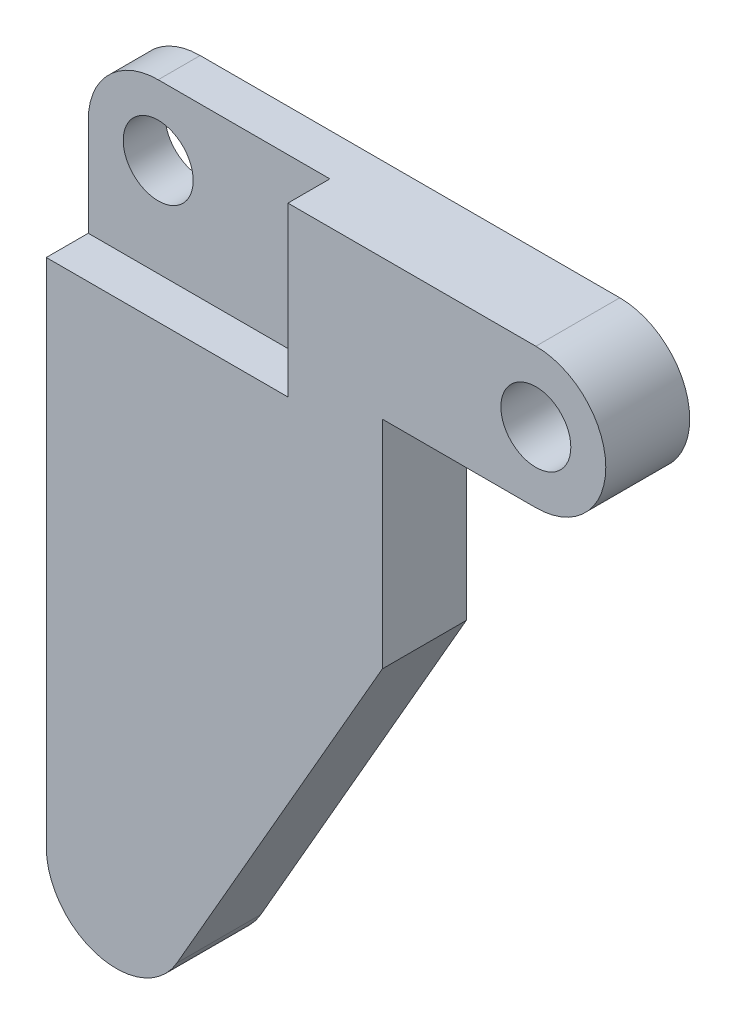
ISO-10303-21;
HEADER;
FILE_DESCRIPTION(('STEP AP214'),'2;1');
FILE_NAME('part.step','',(''),(''),'','','');
FILE_SCHEMA(('AUTOMOTIVE_DESIGN { 1 0 10303 214 1 1 1 1 }'));
ENDSEC;
DATA;
#1=APPLICATION_CONTEXT('core data for automotive mechanical design processes');
#2=APPLICATION_PROTOCOL_DEFINITION('international standard','automotive_design',2000,#1);
#3=PRODUCT_CONTEXT('',#1,'mechanical');
#4=PRODUCT('Part','Part','',(#3));
#5=PRODUCT_RELATED_PRODUCT_CATEGORY('part','',(#4));
#6=PRODUCT_DEFINITION_FORMATION('','',#4);
#7=PRODUCT_DEFINITION_CONTEXT('part definition',#1,'design');
#8=PRODUCT_DEFINITION('design','',#6,#7);
#9=PRODUCT_DEFINITION_SHAPE('','',#8);
#10=(LENGTH_UNIT() NAMED_UNIT(*) SI_UNIT(.MILLI.,.METRE.));
#11=(NAMED_UNIT(*) PLANE_ANGLE_UNIT() SI_UNIT($,.RADIAN.));
#12=(NAMED_UNIT(*) SI_UNIT($,.STERADIAN.) SOLID_ANGLE_UNIT());
#13=UNCERTAINTY_MEASURE_WITH_UNIT(LENGTH_MEASURE(1.E-05),#10,'distance_accuracy_value','');
#14=(GEOMETRIC_REPRESENTATION_CONTEXT(3) GLOBAL_UNCERTAINTY_ASSIGNED_CONTEXT((#13)) GLOBAL_UNIT_ASSIGNED_CONTEXT((#10,
#11,#12)) REPRESENTATION_CONTEXT('',''));
#15=CARTESIAN_POINT('',(0.,0.,0.));
#16=DIRECTION('',(0.,0.,1.));
#17=DIRECTION('',(1.,0.,0.));
#18=AXIS2_PLACEMENT_3D('',#15,#16,#17);
#19=CARTESIAN_POINT('',(0.,0.,-6.));
#20=DIRECTION('',(0.,0.,1.));
#21=DIRECTION('',(1.,0.,0.));
#22=AXIS2_PLACEMENT_3D('',#19,#20,#21);
#23=CYLINDRICAL_SURFACE('',#22,5.);
#24=DIRECTION('',(0.,0.,1.));
#25=VECTOR('',#24,1.);
#26=CARTESIAN_POINT('',(-5.,0.,-6.));
#27=LINE('',#26,#25);
#28=CARTESIAN_POINT('',(-5.,0.,-6.));
#29=VERTEX_POINT('',#28);
#30=CARTESIAN_POINT('',(-5.,0.,-3.));
#31=VERTEX_POINT('',#30);
#32=EDGE_CURVE('E131',#29,#31,#27,.T.);
#33=ORIENTED_EDGE('',*,*,#32,.T.);
#34=CARTESIAN_POINT('',(0.,0.,-3.));
#35=DIRECTION('',(0.,0.,1.));
#36=DIRECTION('',(1.,0.,0.));
#37=AXIS2_PLACEMENT_3D('',#34,#35,#36);
#38=CIRCLE('',#37,5.);
#39=CARTESIAN_POINT('',(0.,5.,-3.));
#40=VERTEX_POINT('',#39);
#41=EDGE_CURVE('E322',#40,#31,#38,.T.);
#42=ORIENTED_EDGE('',*,*,#41,.F.);
#43=DIRECTION('',(0.,0.,1.));
#44=VECTOR('',#43,1.);
#45=CARTESIAN_POINT('',(0.,5.,-6.));
#46=LINE('',#45,#44);
#47=CARTESIAN_POINT('',(0.,5.,-6.));
#48=VERTEX_POINT('',#47);
#49=EDGE_CURVE('E197',#48,#40,#46,.T.);
#50=ORIENTED_EDGE('',*,*,#49,.F.);
#51=CARTESIAN_POINT('',(0.,0.,-6.));
#52=DIRECTION('',(0.,0.,1.));
#53=DIRECTION('',(1.,0.,0.));
#54=AXIS2_PLACEMENT_3D('',#51,#52,#53);
#55=CIRCLE('',#54,5.);
#56=EDGE_CURVE('E147',#48,#29,#55,.T.);
#57=ORIENTED_EDGE('',*,*,#56,.T.);
#58=EDGE_LOOP('',(#33,#42,#50,#57));
#59=FACE_BOUND('',#58,.T.);
#60=ADVANCED_FACE('F41',(#59),#23,.T.);
#61=CARTESIAN_POINT('',(0.,0.,-6.));
#62=DIRECTION('',(0.,0.,1.));
#63=DIRECTION('',(1.,0.,0.));
#64=AXIS2_PLACEMENT_3D('',#61,#62,#63);
#65=CYLINDRICAL_SURFACE('',#64,2.5);
#66=CARTESIAN_POINT('',(0.,0.,-6.));
#67=DIRECTION('',(0.,0.,1.));
#68=DIRECTION('',(1.,0.,0.));
#69=AXIS2_PLACEMENT_3D('',#66,#67,#68);
#70=CIRCLE('',#69,2.5);
#71=CARTESIAN_POINT('',(2.5,0.,-6.));
#72=VERTEX_POINT('',#71);
#73=EDGE_CURVE('E160',#72,#72,#70,.T.);
#74=ORIENTED_EDGE('',*,*,#73,.F.);
#75=EDGE_LOOP('',(#74));
#76=FACE_BOUND('',#75,.T.);
#77=CARTESIAN_POINT('',(0.,0.,-3.));
#78=DIRECTION('',(0.,0.,1.));
#79=DIRECTION('',(1.,0.,0.));
#80=AXIS2_PLACEMENT_3D('',#77,#78,#79);
#81=CIRCLE('',#80,2.5);
#82=CARTESIAN_POINT('',(2.5,0.,-3.));
#83=VERTEX_POINT('',#82);
#84=EDGE_CURVE('E45',#83,#83,#81,.F.);
#85=ORIENTED_EDGE('',*,*,#84,.F.);
#86=EDGE_LOOP('',(#85));
#87=FACE_BOUND('',#86,.T.);
#88=ADVANCED_FACE('F222',(#76,#87),#65,.F.);
#89=CARTESIAN_POINT('',(19.026166694905,0.,-6.));
#90=DIRECTION('',(1.,0.,0.));
#91=DIRECTION('',(0.,0.,-1.));
#92=AXIS2_PLACEMENT_3D('',#89,#90,#91);
#93=PLANE('',#92);
#94=DIRECTION('',(0.,1.,0.));
#95=VECTOR('',#94,1.);
#96=CARTESIAN_POINT('',(19.026166694905,0.,0.));
#97=LINE('',#96,#95);
#98=CARTESIAN_POINT('',(19.026166694905,-20.4631335531953,0.));
#99=VERTEX_POINT('',#98);
#100=CARTESIAN_POINT('',(19.026166694905,-5.,0.));
#101=VERTEX_POINT('',#100);
#102=EDGE_CURVE('E164',#99,#101,#97,.T.);
#103=ORIENTED_EDGE('',*,*,#102,.F.);
#104=DIRECTION('',(0.,0.,1.));
#105=VECTOR('',#104,1.);
#106=CARTESIAN_POINT('',(19.026166694905,-20.4631335531953,-6.));
#107=LINE('',#106,#105);
#108=CARTESIAN_POINT('',(19.026166694905,-20.4631335531953,-6.));
#109=VERTEX_POINT('',#108);
#110=EDGE_CURVE('E11',#109,#99,#107,.T.);
#111=ORIENTED_EDGE('',*,*,#110,.F.);
#112=DIRECTION('',(0.,1.,0.));
#113=VECTOR('',#112,1.);
#114=CARTESIAN_POINT('',(19.026166694905,0.,-6.));
#115=LINE('',#114,#113);
#116=CARTESIAN_POINT('',(19.026166694905,-5.,-6.));
#117=VERTEX_POINT('',#116);
#118=EDGE_CURVE('E191',#109,#117,#115,.T.);
#119=ORIENTED_EDGE('',*,*,#118,.T.);
#120=DIRECTION('',(0.,0.,1.));
#121=VECTOR('',#120,1.);
#122=CARTESIAN_POINT('',(19.026166694905,-5.,-6.));
#123=LINE('',#122,#121);
#124=EDGE_CURVE('E99',#117,#101,#123,.T.);
#125=ORIENTED_EDGE('',*,*,#124,.T.);
#126=EDGE_LOOP('',(#103,#111,#119,#125));
#127=FACE_BOUND('',#126,.T.);
#128=ADVANCED_FACE('F43',(#127),#93,.T.);
#129=CARTESIAN_POINT('',(23.1422799462033,-13.3021878134817,-6.));
#130=DIRECTION('',(0.866981136801682,-0.49834095600308,0.));
#131=DIRECTION('',(0.49834095600308,0.866981136801682,0.));
#132=AXIS2_PLACEMENT_3D('',#129,#130,#131);
#133=PLANE('',#132);
#134=DIRECTION('',(0.49834095600308,0.866981136801682,0.));
#135=VECTOR('',#134,1.);
#136=CARTESIAN_POINT('',(23.1422799462033,-13.3021878134817,0.));
#137=LINE('',#136,#135);
#138=CARTESIAN_POINT('',(4.33490568400853,-46.0220325737255,0.));
#139=VERTEX_POINT('',#138);
#140=EDGE_CURVE('E184',#139,#99,#137,.T.);
#141=ORIENTED_EDGE('',*,*,#140,.F.);
#142=DIRECTION('',(0.,0.,1.));
#143=VECTOR('',#142,1.);
#144=CARTESIAN_POINT('',(4.33490568400853,-46.0220325737255,-6.));
#145=LINE('',#144,#143);
#146=CARTESIAN_POINT('',(4.33490568400853,-46.0220325737255,-6.));
#147=VERTEX_POINT('',#146);
#148=EDGE_CURVE('E51',#147,#139,#145,.T.);
#149=ORIENTED_EDGE('',*,*,#148,.F.);
#150=DIRECTION('',(0.49834095600308,0.866981136801682,0.));
#151=VECTOR('',#150,1.);
#152=CARTESIAN_POINT('',(23.1422799462033,-13.3021878134817,-6.));
#153=LINE('',#152,#151);
#154=EDGE_CURVE('E140',#147,#109,#153,.T.);
#155=ORIENTED_EDGE('',*,*,#154,.T.);
#156=ORIENTED_EDGE('',*,*,#110,.T.);
#157=EDGE_LOOP('',(#141,#149,#155,#156));
#158=FACE_BOUND('',#157,.T.);
#159=ADVANCED_FACE('F214',(#158),#133,.T.);
#160=CARTESIAN_POINT('',(0.,-43.5303277937103,-6.));
#161=DIRECTION('',(0.,0.,1.));
#162=DIRECTION('',(1.,0.,0.));
#163=AXIS2_PLACEMENT_3D('',#160,#161,#162);
#164=CYLINDRICAL_SURFACE('',#163,5.);
#165=CARTESIAN_POINT('',(0.,-43.5303277937103,0.));
#166=DIRECTION('',(0.,0.,1.));
#167=DIRECTION('',(1.,0.,0.));
#168=AXIS2_PLACEMENT_3D('',#165,#166,#167);
#169=CIRCLE('',#168,5.);
#170=CARTESIAN_POINT('',(-5.,-43.5303277937101,0.));
#171=VERTEX_POINT('',#170);
#172=EDGE_CURVE('E126',#171,#139,#169,.T.);
#173=ORIENTED_EDGE('',*,*,#172,.F.);
#174=DIRECTION('',(0.,0.,1.));
#175=VECTOR('',#174,1.);
#176=CARTESIAN_POINT('',(-5.,-43.5303277937101,-6.));
#177=LINE('',#176,#175);
#178=CARTESIAN_POINT('',(-5.,-43.5303277937101,-6.));
#179=VERTEX_POINT('',#178);
#180=EDGE_CURVE('E120',#179,#171,#177,.T.);
#181=ORIENTED_EDGE('',*,*,#180,.F.);
#182=CARTESIAN_POINT('',(0.,-43.5303277937103,-6.));
#183=DIRECTION('',(0.,0.,1.));
#184=DIRECTION('',(1.,0.,0.));
#185=AXIS2_PLACEMENT_3D('',#182,#183,#184);
#186=CIRCLE('',#185,5.);
#187=EDGE_CURVE('E123',#179,#147,#186,.T.);
#188=ORIENTED_EDGE('',*,*,#187,.T.);
#189=ORIENTED_EDGE('',*,*,#148,.T.);
#190=EDGE_LOOP('',(#173,#181,#188,#189));
#191=FACE_BOUND('',#190,.T.);
#192=ADVANCED_FACE('F122',(#191),#164,.T.);
#193=CARTESIAN_POINT('',(-5.,0.,-6.));
#194=DIRECTION('',(-1.,0.,0.));
#195=DIRECTION('',(0.,0.,1.));
#196=AXIS2_PLACEMENT_3D('',#193,#194,#195);
#197=PLANE('',#196);
#198=DIRECTION('',(0.,0.,1.));
#199=VECTOR('',#198,1.);
#200=CARTESIAN_POINT('',(-5.,-7.00419034366792,-3.));
#201=LINE('',#200,#199);
#202=CARTESIAN_POINT('',(-5.,-7.00419034366792,-3.));
#203=VERTEX_POINT('',#202);
#204=CARTESIAN_POINT('',(-5.,-7.00419034366792,0.));
#205=VERTEX_POINT('',#204);
#206=EDGE_CURVE('E59',#203,#205,#201,.T.);
#207=ORIENTED_EDGE('',*,*,#206,.F.);
#208=DIRECTION('',(0.,-1.,0.));
#209=VECTOR('',#208,1.);
#210=CARTESIAN_POINT('',(-5.,-7.00419034366792,-3.));
#211=LINE('',#210,#209);
#212=EDGE_CURVE('E324',#31,#203,#211,.T.);
#213=ORIENTED_EDGE('',*,*,#212,.F.);
#214=ORIENTED_EDGE('',*,*,#32,.F.);
#215=DIRECTION('',(0.,-1.,0.));
#216=VECTOR('',#215,1.);
#217=CARTESIAN_POINT('',(-5.,0.,-6.));
#218=LINE('',#217,#216);
#219=EDGE_CURVE('E138',#29,#179,#218,.T.);
#220=ORIENTED_EDGE('',*,*,#219,.T.);
#221=ORIENTED_EDGE('',*,*,#180,.T.);
#222=DIRECTION('',(0.,-1.,0.));
#223=VECTOR('',#222,1.);
#224=CARTESIAN_POINT('',(-5.,0.,0.));
#225=LINE('',#224,#223);
#226=EDGE_CURVE('E179',#205,#171,#225,.T.);
#227=ORIENTED_EDGE('',*,*,#226,.F.);
#228=EDGE_LOOP('',(#207,#213,#214,#220,#221,#227));
#229=FACE_BOUND('',#228,.T.);
#230=ADVANCED_FACE('F143',(#229),#197,.T.);
#231=CARTESIAN_POINT('',(0.,5.,-6.));
#232=DIRECTION('',(0.,-1.,0.));
#233=DIRECTION('',(0.,0.,-1.));
#234=AXIS2_PLACEMENT_3D('',#231,#232,#233);
#235=PLANE('',#234);
#236=DIRECTION('',(-1.,0.,0.));
#237=VECTOR('',#236,1.);
#238=CARTESIAN_POINT('',(0.,5.,-3.));
#239=LINE('',#238,#237);
#240=CARTESIAN_POINT('',(12.275244192395,5.,-3.));
#241=VERTEX_POINT('',#240);
#242=EDGE_CURVE('E274',#241,#40,#239,.T.);
#243=ORIENTED_EDGE('',*,*,#242,.F.);
#244=DIRECTION('',(0.,0.,1.));
#245=VECTOR('',#244,1.);
#246=CARTESIAN_POINT('',(12.275244192395,5.,-3.));
#247=LINE('',#246,#245);
#248=CARTESIAN_POINT('',(12.275244192395,5.,0.));
#249=VERTEX_POINT('',#248);
#250=EDGE_CURVE('E280',#241,#249,#247,.T.);
#251=ORIENTED_EDGE('',*,*,#250,.T.);
#252=DIRECTION('',(1.,0.,0.));
#253=VECTOR('',#252,1.);
#254=CARTESIAN_POINT('',(0.,5.,0.));
#255=LINE('',#254,#253);
#256=CARTESIAN_POINT('',(30.,5.,0.));
#257=VERTEX_POINT('',#256);
#258=EDGE_CURVE('E176',#249,#257,#255,.T.);
#259=ORIENTED_EDGE('',*,*,#258,.T.);
#260=DIRECTION('',(0.,0.,1.));
#261=VECTOR('',#260,1.);
#262=CARTESIAN_POINT('',(30.,5.,-6.));
#263=LINE('',#262,#261);
#264=CARTESIAN_POINT('',(30.,5.,-6.));
#265=VERTEX_POINT('',#264);
#266=EDGE_CURVE('E201',#265,#257,#263,.T.);
#267=ORIENTED_EDGE('',*,*,#266,.F.);
#268=DIRECTION('',(1.,0.,0.));
#269=VECTOR('',#268,1.);
#270=CARTESIAN_POINT('',(0.,5.,-6.));
#271=LINE('',#270,#269);
#272=EDGE_CURVE('E150',#48,#265,#271,.T.);
#273=ORIENTED_EDGE('',*,*,#272,.F.);
#274=ORIENTED_EDGE('',*,*,#49,.T.);
#275=EDGE_LOOP('',(#243,#251,#259,#267,#273,#274));
#276=FACE_BOUND('',#275,.T.);
#277=ADVANCED_FACE('F234',(#276),#235,.F.);
#278=CARTESIAN_POINT('',(30.,0.,-6.));
#279=DIRECTION('',(0.,0.,1.));
#280=DIRECTION('',(1.,0.,0.));
#281=AXIS2_PLACEMENT_3D('',#278,#279,#280);
#282=CYLINDRICAL_SURFACE('',#281,5.);
#283=CARTESIAN_POINT('',(30.,0.,0.));
#284=DIRECTION('',(0.,0.,1.));
#285=DIRECTION('',(1.,0.,0.));
#286=AXIS2_PLACEMENT_3D('',#283,#284,#285);
#287=CIRCLE('',#286,5.);
#288=CARTESIAN_POINT('',(30.,-5.,0.));
#289=VERTEX_POINT('',#288);
#290=EDGE_CURVE('E172',#289,#257,#287,.T.);
#291=ORIENTED_EDGE('',*,*,#290,.F.);
#292=DIRECTION('',(0.,0.,1.));
#293=VECTOR('',#292,1.);
#294=CARTESIAN_POINT('',(30.,-5.,-6.));
#295=LINE('',#294,#293);
#296=CARTESIAN_POINT('',(30.,-5.,-6.));
#297=VERTEX_POINT('',#296);
#298=EDGE_CURVE('E205',#297,#289,#295,.T.);
#299=ORIENTED_EDGE('',*,*,#298,.F.);
#300=CARTESIAN_POINT('',(30.,0.,-6.));
#301=DIRECTION('',(0.,0.,1.));
#302=DIRECTION('',(1.,0.,0.));
#303=AXIS2_PLACEMENT_3D('',#300,#301,#302);
#304=CIRCLE('',#303,5.);
#305=EDGE_CURVE('E302',#297,#265,#304,.T.);
#306=ORIENTED_EDGE('',*,*,#305,.T.);
#307=ORIENTED_EDGE('',*,*,#266,.T.);
#308=EDGE_LOOP('',(#291,#299,#306,#307));
#309=FACE_BOUND('',#308,.T.);
#310=ADVANCED_FACE('F237',(#309),#282,.T.);
#311=CARTESIAN_POINT('',(30.,0.,-6.));
#312=DIRECTION('',(0.,0.,1.));
#313=DIRECTION('',(1.,0.,0.));
#314=AXIS2_PLACEMENT_3D('',#311,#312,#313);
#315=CYLINDRICAL_SURFACE('',#314,2.5);
#316=CARTESIAN_POINT('',(30.,0.,-6.));
#317=DIRECTION('',(0.,0.,1.));
#318=DIRECTION('',(1.,0.,0.));
#319=AXIS2_PLACEMENT_3D('',#316,#317,#318);
#320=CIRCLE('',#319,2.5);
#321=CARTESIAN_POINT('',(32.5,0.,-6.));
#322=VERTEX_POINT('',#321);
#323=EDGE_CURVE('E156',#322,#322,#320,.T.);
#324=ORIENTED_EDGE('',*,*,#323,.F.);
#325=EDGE_LOOP('',(#324));
#326=FACE_BOUND('',#325,.T.);
#327=CARTESIAN_POINT('',(30.,0.,0.));
#328=DIRECTION('',(0.,0.,1.));
#329=DIRECTION('',(1.,0.,0.));
#330=AXIS2_PLACEMENT_3D('',#327,#328,#329);
#331=CIRCLE('',#330,2.5);
#332=CARTESIAN_POINT('',(32.5,0.,0.));
#333=VERTEX_POINT('',#332);
#334=EDGE_CURVE('E188',#333,#333,#331,.T.);
#335=ORIENTED_EDGE('',*,*,#334,.T.);
#336=EDGE_LOOP('',(#335));
#337=FACE_BOUND('',#336,.T.);
#338=ADVANCED_FACE('F240',(#326,#337),#315,.F.);
#339=CARTESIAN_POINT('',(0.,-5.,-6.));
#340=DIRECTION('',(0.,-1.,0.));
#341=DIRECTION('',(0.,0.,-1.));
#342=AXIS2_PLACEMENT_3D('',#339,#340,#341);
#343=PLANE('',#342);
#344=DIRECTION('',(1.,0.,0.));
#345=VECTOR('',#344,1.);
#346=CARTESIAN_POINT('',(0.,-5.,0.));
#347=LINE('',#346,#345);
#348=EDGE_CURVE('E168',#101,#289,#347,.T.);
#349=ORIENTED_EDGE('',*,*,#348,.F.);
#350=ORIENTED_EDGE('',*,*,#124,.F.);
#351=DIRECTION('',(1.,0.,0.));
#352=VECTOR('',#351,1.);
#353=CARTESIAN_POINT('',(0.,-5.,-6.));
#354=LINE('',#353,#352);
#355=EDGE_CURVE('E299',#117,#297,#354,.T.);
#356=ORIENTED_EDGE('',*,*,#355,.T.);
#357=ORIENTED_EDGE('',*,*,#298,.T.);
#358=EDGE_LOOP('',(#349,#350,#356,#357));
#359=FACE_BOUND('',#358,.T.);
#360=ADVANCED_FACE('F208',(#359),#343,.T.);
#361=CARTESIAN_POINT('',(0.,0.,-6.));
#362=DIRECTION('',(0.,0.,1.));
#363=DIRECTION('',(1.,0.,0.));
#364=AXIS2_PLACEMENT_3D('',#361,#362,#363);
#365=PLANE('',#364);
#366=ORIENTED_EDGE('',*,*,#118,.F.);
#367=ORIENTED_EDGE('',*,*,#154,.F.);
#368=ORIENTED_EDGE('',*,*,#187,.F.);
#369=ORIENTED_EDGE('',*,*,#219,.F.);
#370=ORIENTED_EDGE('',*,*,#56,.F.);
#371=ORIENTED_EDGE('',*,*,#272,.T.);
#372=ORIENTED_EDGE('',*,*,#305,.F.);
#373=ORIENTED_EDGE('',*,*,#355,.F.);
#374=EDGE_LOOP('',(#366,#367,#368,#369,#370,#371,#372,#373));
#375=FACE_BOUND('',#374,.T.);
#376=ORIENTED_EDGE('',*,*,#323,.T.);
#377=EDGE_LOOP('',(#376));
#378=FACE_BOUND('',#377,.T.);
#379=ORIENTED_EDGE('',*,*,#73,.T.);
#380=EDGE_LOOP('',(#379));
#381=FACE_BOUND('',#380,.T.);
#382=ADVANCED_FACE('F135',(#375,#378,#381),#365,.F.);
#383=CARTESIAN_POINT('',(0.,0.,0.));
#384=DIRECTION('',(0.,0.,1.));
#385=DIRECTION('',(1.,0.,0.));
#386=AXIS2_PLACEMENT_3D('',#383,#384,#385);
#387=PLANE('',#386);
#388=DIRECTION('',(0.,1.,0.));
#389=VECTOR('',#388,1.);
#390=CARTESIAN_POINT('',(12.275244192395,5.,0.));
#391=LINE('',#390,#389);
#392=CARTESIAN_POINT('',(12.275244192395,-7.00419034366792,0.));
#393=VERTEX_POINT('',#392);
#394=EDGE_CURVE('E291',#393,#249,#391,.T.);
#395=ORIENTED_EDGE('',*,*,#394,.F.);
#396=DIRECTION('',(1.,0.,0.));
#397=VECTOR('',#396,1.);
#398=CARTESIAN_POINT('',(12.275244192395,-7.00419034366792,0.));
#399=LINE('',#398,#397);
#400=EDGE_CURVE('E333',#205,#393,#399,.T.);
#401=ORIENTED_EDGE('',*,*,#400,.F.);
#402=ORIENTED_EDGE('',*,*,#226,.T.);
#403=ORIENTED_EDGE('',*,*,#172,.T.);
#404=ORIENTED_EDGE('',*,*,#140,.T.);
#405=ORIENTED_EDGE('',*,*,#102,.T.);
#406=ORIENTED_EDGE('',*,*,#348,.T.);
#407=ORIENTED_EDGE('',*,*,#290,.T.);
#408=ORIENTED_EDGE('',*,*,#258,.F.);
#409=EDGE_LOOP('',(#395,#401,#402,#403,#404,#405,#406,#407,#408));
#410=FACE_BOUND('',#409,.T.);
#411=ORIENTED_EDGE('',*,*,#334,.F.);
#412=EDGE_LOOP('',(#411));
#413=FACE_BOUND('',#412,.T.);
#414=ADVANCED_FACE('F212',(#410,#413),#387,.T.);
#415=CARTESIAN_POINT('',(0.,0.,-3.));
#416=DIRECTION('',(0.,0.,1.));
#417=DIRECTION('',(1.,0.,0.));
#418=AXIS2_PLACEMENT_3D('',#415,#416,#417);
#419=PLANE('',#418);
#420=ORIENTED_EDGE('',*,*,#242,.T.);
#421=ORIENTED_EDGE('',*,*,#41,.T.);
#422=ORIENTED_EDGE('',*,*,#212,.T.);
#423=DIRECTION('',(1.,0.,0.));
#424=VECTOR('',#423,1.);
#425=CARTESIAN_POINT('',(12.275244192395,-7.00419034366792,-3.));
#426=LINE('',#425,#424);
#427=CARTESIAN_POINT('',(12.275244192395,-7.00419034366792,-3.));
#428=VERTEX_POINT('',#427);
#429=EDGE_CURVE('E328',#203,#428,#426,.T.);
#430=ORIENTED_EDGE('',*,*,#429,.T.);
#431=DIRECTION('',(0.,1.,0.));
#432=VECTOR('',#431,1.);
#433=CARTESIAN_POINT('',(12.275244192395,5.,-3.));
#434=LINE('',#433,#432);
#435=EDGE_CURVE('E296',#428,#241,#434,.T.);
#436=ORIENTED_EDGE('',*,*,#435,.T.);
#437=EDGE_LOOP('',(#420,#421,#422,#430,#436));
#438=FACE_BOUND('',#437,.T.);
#439=ORIENTED_EDGE('',*,*,#84,.T.);
#440=EDGE_LOOP('',(#439));
#441=FACE_BOUND('',#440,.T.);
#442=ADVANCED_FACE('F255',(#438,#441),#419,.T.);
#443=CARTESIAN_POINT('',(12.275244192395,5.,-3.));
#444=DIRECTION('',(1.,0.,0.));
#445=DIRECTION('',(0.,1.,0.));
#446=AXIS2_PLACEMENT_3D('',#443,#444,#445);
#447=PLANE('',#446);
#448=ORIENTED_EDGE('',*,*,#394,.T.);
#449=ORIENTED_EDGE('',*,*,#250,.F.);
#450=ORIENTED_EDGE('',*,*,#435,.F.);
#451=DIRECTION('',(0.,0.,1.));
#452=VECTOR('',#451,1.);
#453=CARTESIAN_POINT('',(12.275244192395,-7.00419034366792,-3.));
#454=LINE('',#453,#452);
#455=EDGE_CURVE('E283',#428,#393,#454,.T.);
#456=ORIENTED_EDGE('',*,*,#455,.T.);
#457=EDGE_LOOP('',(#448,#449,#450,#456));
#458=FACE_BOUND('',#457,.T.);
#459=ADVANCED_FACE('F260',(#458),#447,.F.);
#460=CARTESIAN_POINT('',(12.275244192395,-7.00419034366792,-3.));
#461=DIRECTION('',(0.,-1.,0.));
#462=DIRECTION('',(0.,0.,-1.));
#463=AXIS2_PLACEMENT_3D('',#460,#461,#462);
#464=PLANE('',#463);
#465=ORIENTED_EDGE('',*,*,#400,.T.);
#466=ORIENTED_EDGE('',*,*,#455,.F.);
#467=ORIENTED_EDGE('',*,*,#429,.F.);
#468=ORIENTED_EDGE('',*,*,#206,.T.);
#469=EDGE_LOOP('',(#465,#466,#467,#468));
#470=FACE_BOUND('',#469,.T.);
#471=ADVANCED_FACE('F257',(#470),#464,.F.);
#472=CLOSED_SHELL('',(#60,#88,#128,#159,#192,#230,#277,#310,#338,#360,#382,#414,#442,#459,#471));
#473=MANIFOLD_SOLID_BREP('B2',#472);
#474=ADVANCED_BREP_SHAPE_REPRESENTATION('',(#18,#473),#14);
#475=SHAPE_DEFINITION_REPRESENTATION(#9,#474);
ENDSEC;
END-ISO-10303-21;
